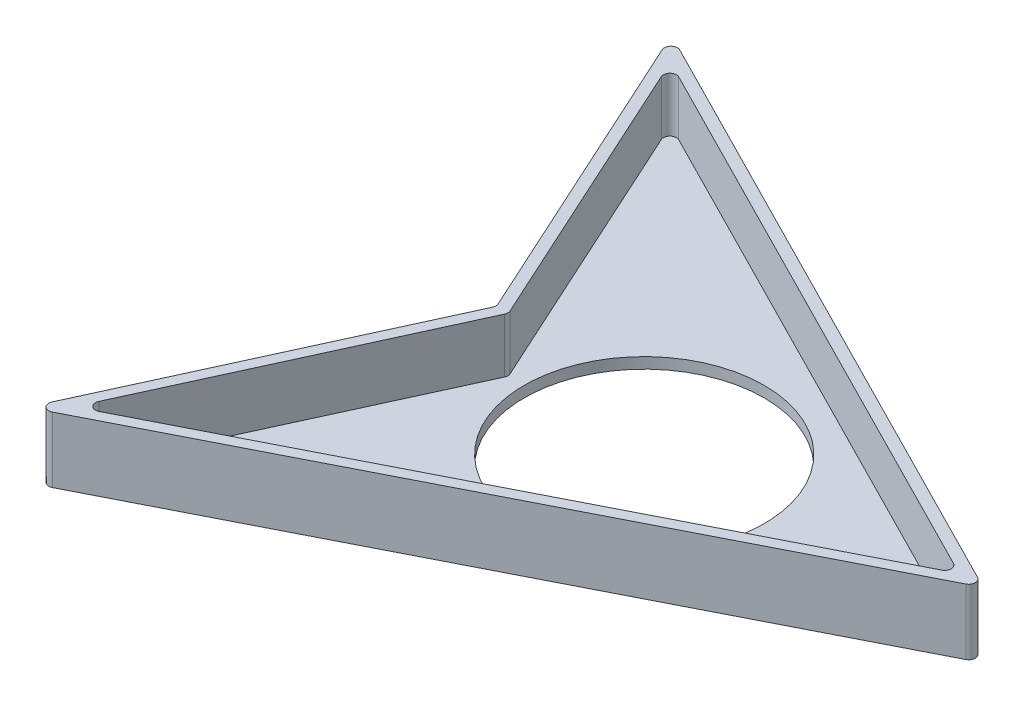
ISO-10303-21;
HEADER;
FILE_DESCRIPTION(('STEP AP214'),'2;1');
FILE_NAME('part.step','',(''),(''),'','','');
FILE_SCHEMA(('AUTOMOTIVE_DESIGN { 1 0 10303 214 1 1 1 1 }'));
ENDSEC;
DATA;
#1=APPLICATION_CONTEXT('core data for automotive mechanical design processes');
#2=APPLICATION_PROTOCOL_DEFINITION('international standard','automotive_design',2000,#1);
#3=PRODUCT_CONTEXT('',#1,'mechanical');
#4=PRODUCT('Part','Part','',(#3));
#5=PRODUCT_RELATED_PRODUCT_CATEGORY('part','',(#4));
#6=PRODUCT_DEFINITION_FORMATION('','',#4);
#7=PRODUCT_DEFINITION_CONTEXT('part definition',#1,'design');
#8=PRODUCT_DEFINITION('design','',#6,#7);
#9=PRODUCT_DEFINITION_SHAPE('','',#8);
#10=(LENGTH_UNIT() NAMED_UNIT(*) SI_UNIT(.MILLI.,.METRE.));
#11=(NAMED_UNIT(*) PLANE_ANGLE_UNIT() SI_UNIT($,.RADIAN.));
#12=(NAMED_UNIT(*) SI_UNIT($,.STERADIAN.) SOLID_ANGLE_UNIT());
#13=UNCERTAINTY_MEASURE_WITH_UNIT(LENGTH_MEASURE(1.E-05),#10,'distance_accuracy_value','');
#14=(GEOMETRIC_REPRESENTATION_CONTEXT(3) GLOBAL_UNCERTAINTY_ASSIGNED_CONTEXT((#13)) GLOBAL_UNIT_ASSIGNED_CONTEXT((#10,
#11,#12)) REPRESENTATION_CONTEXT('',''));
#15=CARTESIAN_POINT('',(0.,0.,0.));
#16=DIRECTION('',(0.,0.,1.));
#17=DIRECTION('',(1.,0.,0.));
#18=AXIS2_PLACEMENT_3D('',#15,#16,#17);
#19=CARTESIAN_POINT('',(0.,2.5,0.));
#20=DIRECTION('',(0.,-1.,0.));
#21=DIRECTION('',(0.,0.,-1.));
#22=AXIS2_PLACEMENT_3D('',#19,#20,#21);
#23=PLANE('',#22);
#24=DIRECTION('',(-0.415630656048194,0.,0.909533483579878));
#25=VECTOR('',#24,1.);
#26=CARTESIAN_POINT('',(-0.636673438505915,2.5,-0.290941459233736));
#27=LINE('',#26,#25);
#28=CARTESIAN_POINT('',(-0.826604700373397,2.5,0.124689196814458));
#29=VERTEX_POINT('',#28);
#30=CARTESIAN_POINT('',(-7.16274680552667,2.5,13.9902049317485));
#31=VERTEX_POINT('',#30);
#32=EDGE_CURVE('E181',#29,#31,#27,.T.);
#33=ORIENTED_EDGE('',*,*,#32,.T.);
#34=CARTESIAN_POINT('',(-6.88988676045271,2.5,14.114894128563));
#35=DIRECTION('',(0.,-1.,0.));
#36=DIRECTION('',(0.,0.,-1.));
#37=AXIS2_PLACEMENT_3D('',#34,#35,#36);
#38=CIRCLE('',#37,0.3);
#39=CARTESIAN_POINT('',(-6.7539651135463,2.5,14.3823362828735));
#40=VERTEX_POINT('',#39);
#41=EDGE_CURVE('E208',#31,#40,#38,.F.);
#42=ORIENTED_EDGE('',*,*,#41,.T.);
#43=DIRECTION('',(0.89147384770171,0.,-0.453072156354711));
#44=VECTOR('',#43,1.);
#45=CARTESIAN_POINT('',(4.42263808672645,2.5,8.7020712636321));
#46=LINE('',#45,#44);
#47=CARTESIAN_POINT('',(21.0187832273184,2.5,0.267442154310512));
#48=VERTEX_POINT('',#47);
#49=EDGE_CURVE('E176',#40,#48,#46,.T.);
#50=ORIENTED_EDGE('',*,*,#49,.T.);
#51=CARTESIAN_POINT('',(20.882861580412,2.5,0.));
#52=DIRECTION('',(0.,-1.,0.));
#53=DIRECTION('',(0.,0.,-1.));
#54=AXIS2_PLACEMENT_3D('',#51,#52,#53);
#55=CIRCLE('',#54,0.3);
#56=CARTESIAN_POINT('',(21.0187832273184,2.5,-0.267442154310512));
#57=VERTEX_POINT('',#56);
#58=EDGE_CURVE('E204',#48,#57,#55,.F.);
#59=ORIENTED_EDGE('',*,*,#58,.T.);
#60=DIRECTION('',(-0.89147384770171,0.,-0.453072156354711));
#61=VECTOR('',#60,1.);
#62=CARTESIAN_POINT('',(4.42263808672645,2.5,-8.7020712636321));
#63=LINE('',#62,#61);
#64=CARTESIAN_POINT('',(-6.7539651135463,2.5,-14.3823362828735));
#65=VERTEX_POINT('',#64);
#66=EDGE_CURVE('E279',#57,#65,#63,.T.);
#67=ORIENTED_EDGE('',*,*,#66,.T.);
#68=CARTESIAN_POINT('',(-6.88988676045271,2.5,-14.114894128563));
#69=DIRECTION('',(0.,-1.,0.));
#70=DIRECTION('',(0.,0.,-1.));
#71=AXIS2_PLACEMENT_3D('',#68,#69,#70);
#72=CIRCLE('',#71,0.3);
#73=CARTESIAN_POINT('',(-7.16274680552667,2.5,-13.9902049317485));
#74=VERTEX_POINT('',#73);
#75=EDGE_CURVE('E206',#65,#74,#72,.F.);
#76=ORIENTED_EDGE('',*,*,#75,.T.);
#77=DIRECTION('',(0.415630656048194,0.,0.909533483579878));
#78=VECTOR('',#77,1.);
#79=CARTESIAN_POINT('',(-0.636673438505915,2.5,0.290941459233736));
#80=LINE('',#79,#78);
#81=CARTESIAN_POINT('',(-0.826604700373397,2.5,-0.124689196814458));
#82=VERTEX_POINT('',#81);
#83=EDGE_CURVE('E282',#74,#82,#80,.T.);
#84=ORIENTED_EDGE('',*,*,#83,.T.);
#85=CARTESIAN_POINT('',(-1.09946474544736,2.5,0.));
#86=DIRECTION('',(0.,-1.,0.));
#87=DIRECTION('',(0.,0.,-1.));
#88=AXIS2_PLACEMENT_3D('',#85,#86,#87);
#89=CIRCLE('',#88,0.3);
#90=EDGE_CURVE('E11',#82,#29,#89,.T.);
#91=ORIENTED_EDGE('',*,*,#90,.T.);
#92=EDGE_LOOP('',(#33,#42,#50,#59,#67,#76,#84,#91));
#93=FACE_BOUND('',#92,.T.);
#94=DIRECTION('',(-0.415630656048194,0.,0.909533483579878));
#95=VECTOR('',#94,1.);
#96=CARTESIAN_POINT('',(-6.46994338022636,2.5,13.677119477257));
#97=LINE('',#96,#95);
#98=CARTESIAN_POINT('',(-0.276872327649716,2.5,0.124689196814458));
#99=VERTEX_POINT('',#98);
#100=CARTESIAN_POINT('',(-6.11288835496079,2.5,12.8957683034835));
#101=VERTEX_POINT('',#100);
#102=EDGE_CURVE('E365',#99,#101,#97,.T.);
#103=ORIENTED_EDGE('',*,*,#102,.F.);
#104=CARTESIAN_POINT('',(-0.549732372723681,2.5,0.));
#105=DIRECTION('',(0.,-1.,0.));
#106=DIRECTION('',(0.,0.,-1.));
#107=AXIS2_PLACEMENT_3D('',#104,#105,#106);
#108=CIRCLE('',#107,0.3);
#109=CARTESIAN_POINT('',(-0.276872327649717,2.5,-0.12468919681446));
#110=VERTEX_POINT('',#109);
#111=EDGE_CURVE('E175',#99,#110,#108,.F.);
#112=ORIENTED_EDGE('',*,*,#111,.T.);
#113=DIRECTION('',(0.415630656048194,0.,0.909533483579878));
#114=VECTOR('',#113,1.);
#115=CARTESIAN_POINT('',(-6.46994338022635,2.5,-13.677119477257));
#116=LINE('',#115,#114);
#117=CARTESIAN_POINT('',(-6.11288835496078,2.5,-12.8957683034835));
#118=VERTEX_POINT('',#117);
#119=EDGE_CURVE('E246',#118,#110,#116,.T.);
#120=ORIENTED_EDGE('',*,*,#119,.F.);
#121=CARTESIAN_POINT('',(-5.84002830988682,2.5,-13.0204575002979));
#122=DIRECTION('',(0.,-1.,0.));
#123=DIRECTION('',(0.,0.,-1.));
#124=AXIS2_PLACEMENT_3D('',#121,#122,#123);
#125=CIRCLE('',#124,0.3);
#126=CARTESIAN_POINT('',(-5.7041066629804,2.5,-13.2878996546085));
#127=VERTEX_POINT('',#126);
#128=EDGE_CURVE('E160',#118,#127,#125,.T.);
#129=ORIENTED_EDGE('',*,*,#128,.T.);
#130=DIRECTION('',(-0.89147384770171,0.,-0.453072156354711));
#131=VECTOR('',#130,1.);
#132=CARTESIAN_POINT('',(20.441430790206,2.5,0.));
#133=LINE('',#132,#131);
#134=CARTESIAN_POINT('',(19.9152062518034,2.5,-0.267442154310513));
#135=VERTEX_POINT('',#134);
#136=EDGE_CURVE('E243',#135,#127,#133,.T.);
#137=ORIENTED_EDGE('',*,*,#136,.F.);
#138=CARTESIAN_POINT('',(19.779284604897,2.5,0.));
#139=DIRECTION('',(0.,-1.,0.));
#140=DIRECTION('',(0.,0.,-1.));
#141=AXIS2_PLACEMENT_3D('',#138,#139,#140);
#142=CIRCLE('',#141,0.3);
#143=CARTESIAN_POINT('',(19.9152062518034,2.5,0.267442154310513));
#144=VERTEX_POINT('',#143);
#145=EDGE_CURVE('E161',#135,#144,#142,.T.);
#146=ORIENTED_EDGE('',*,*,#145,.T.);
#147=DIRECTION('',(0.89147384770171,0.,-0.453072156354711));
#148=VECTOR('',#147,1.);
#149=CARTESIAN_POINT('',(20.441430790206,2.5,0.));
#150=LINE('',#149,#148);
#151=CARTESIAN_POINT('',(-5.7041066629804,2.5,13.2878996546085));
#152=VERTEX_POINT('',#151);
#153=EDGE_CURVE('E271',#152,#144,#150,.T.);
#154=ORIENTED_EDGE('',*,*,#153,.F.);
#155=CARTESIAN_POINT('',(-5.84002830988682,2.5,13.0204575002979));
#156=DIRECTION('',(0.,-1.,0.));
#157=DIRECTION('',(0.,0.,-1.));
#158=AXIS2_PLACEMENT_3D('',#155,#156,#157);
#159=CIRCLE('',#158,0.3);
#160=EDGE_CURVE('E235',#152,#101,#159,.T.);
#161=ORIENTED_EDGE('',*,*,#160,.T.);
#162=EDGE_LOOP('',(#103,#112,#120,#129,#137,#146,#154,#161));
#163=FACE_BOUND('',#162,.T.);
#164=ADVANCED_FACE('F37',(#93,#163),#23,.F.);
#165=CARTESIAN_POINT('',(20.6679668683834,2.5,-0.445736923850855));
#166=DIRECTION('',(-0.453072156354711,0.,0.89147384770171));
#167=DIRECTION('',(0.89147384770171,0.,0.453072156354711));
#168=AXIS2_PLACEMENT_3D('',#165,#166,#167);
#169=PLANE('',#168);
#170=DIRECTION('',(-0.89147384770171,0.,-0.453072156354711));
#171=VECTOR('',#170,1.);
#172=CARTESIAN_POINT('',(4.42263808672645,-0.5,-8.7020712636321));
#173=LINE('',#172,#171);
#174=CARTESIAN_POINT('',(21.0187832273184,-0.5,-0.267442154310512));
#175=VERTEX_POINT('',#174);
#176=CARTESIAN_POINT('',(-6.7539651135463,-0.5,-14.3823362828735));
#177=VERTEX_POINT('',#176);
#178=EDGE_CURVE('E267',#175,#177,#173,.T.);
#179=ORIENTED_EDGE('',*,*,#178,.T.);
#180=DIRECTION('',(0.,-1.,0.));
#181=VECTOR('',#180,1.);
#182=CARTESIAN_POINT('',(-6.75396511354629,2.5,-14.3823362828735));
#183=LINE('',#182,#181);
#184=EDGE_CURVE('E233',#177,#65,#183,.F.);
#185=ORIENTED_EDGE('',*,*,#184,.T.);
#186=ORIENTED_EDGE('',*,*,#66,.F.);
#187=DIRECTION('',(0.,-1.,0.));
#188=VECTOR('',#187,1.);
#189=CARTESIAN_POINT('',(21.0187832273184,2.5,-0.267442154310513));
#190=LINE('',#189,#188);
#191=EDGE_CURVE('E230',#57,#175,#190,.T.);
#192=ORIENTED_EDGE('',*,*,#191,.T.);
#193=EDGE_LOOP('',(#179,#185,#186,#192));
#194=FACE_BOUND('',#193,.T.);
#195=ADVANCED_FACE('F307',(#194),#169,.F.);
#196=CARTESIAN_POINT('',(-6.92471012201629,2.5,-13.4693041492329));
#197=DIRECTION('',(0.909533483579878,0.,-0.415630656048194));
#198=DIRECTION('',(-0.415630656048194,0.,-0.909533483579878));
#199=AXIS2_PLACEMENT_3D('',#196,#197,#198);
#200=PLANE('',#199);
#201=ORIENTED_EDGE('',*,*,#83,.F.);
#202=DIRECTION('',(0.,-1.,0.));
#203=VECTOR('',#202,1.);
#204=CARTESIAN_POINT('',(-7.16274680552667,2.5,-13.9902049317485));
#205=LINE('',#204,#203);
#206=CARTESIAN_POINT('',(-7.16274680552667,-0.5,-13.9902049317485));
#207=VERTEX_POINT('',#206);
#208=EDGE_CURVE('E228',#74,#207,#205,.T.);
#209=ORIENTED_EDGE('',*,*,#208,.T.);
#210=DIRECTION('',(0.415630656048194,0.,0.909533483579878));
#211=VECTOR('',#210,1.);
#212=CARTESIAN_POINT('',(-0.636673438505915,-0.5,0.290941459233736));
#213=LINE('',#212,#211);
#214=CARTESIAN_POINT('',(-0.826604700373397,-0.5,-0.124689196814458));
#215=VERTEX_POINT('',#214);
#216=EDGE_CURVE('E270',#207,#215,#213,.T.);
#217=ORIENTED_EDGE('',*,*,#216,.T.);
#218=DIRECTION('',(0.,-1.,0.));
#219=VECTOR('',#218,1.);
#220=CARTESIAN_POINT('',(-0.826604700373397,2.5,-0.124689196814458));
#221=LINE('',#220,#219);
#222=EDGE_CURVE('E226',#215,#82,#221,.F.);
#223=ORIENTED_EDGE('',*,*,#222,.T.);
#224=EDGE_LOOP('',(#201,#209,#217,#223));
#225=FACE_BOUND('',#224,.T.);
#226=ADVANCED_FACE('F312',(#225),#200,.F.);
#227=CARTESIAN_POINT('',(-6.92471012201629,2.5,13.4693041492329));
#228=DIRECTION('',(0.909533483579878,0.,0.415630656048194));
#229=DIRECTION('',(0.415630656048194,0.,-0.909533483579878));
#230=AXIS2_PLACEMENT_3D('',#227,#228,#229);
#231=PLANE('',#230);
#232=DIRECTION('',(-0.415630656048194,0.,0.909533483579878));
#233=VECTOR('',#232,1.);
#234=CARTESIAN_POINT('',(-0.636673438505915,-0.5,-0.290941459233736));
#235=LINE('',#234,#233);
#236=CARTESIAN_POINT('',(-0.826604700373397,-0.5,0.124689196814458));
#237=VERTEX_POINT('',#236);
#238=CARTESIAN_POINT('',(-7.16274680552667,-0.5,13.9902049317485));
#239=VERTEX_POINT('',#238);
#240=EDGE_CURVE('E273',#237,#239,#235,.T.);
#241=ORIENTED_EDGE('',*,*,#240,.T.);
#242=DIRECTION('',(0.,-1.,0.));
#243=VECTOR('',#242,1.);
#244=CARTESIAN_POINT('',(-7.16274680552667,2.5,13.9902049317485));
#245=LINE('',#244,#243);
#246=EDGE_CURVE('E224',#239,#31,#245,.F.);
#247=ORIENTED_EDGE('',*,*,#246,.T.);
#248=ORIENTED_EDGE('',*,*,#32,.F.);
#249=DIRECTION('',(0.,-1.,0.));
#250=VECTOR('',#249,1.);
#251=CARTESIAN_POINT('',(-0.826604700373397,-0.5,0.124689196814459));
#252=LINE('',#251,#250);
#253=EDGE_CURVE('E221',#29,#237,#252,.T.);
#254=ORIENTED_EDGE('',*,*,#253,.T.);
#255=EDGE_LOOP('',(#241,#247,#248,#254));
#256=FACE_BOUND('',#255,.T.);
#257=ADVANCED_FACE('F316',(#256),#231,.F.);
#258=CARTESIAN_POINT('',(20.6679668683834,2.5,0.445736923850855));
#259=DIRECTION('',(-0.453072156354711,0.,-0.89147384770171));
#260=DIRECTION('',(-0.89147384770171,0.,0.453072156354711));
#261=AXIS2_PLACEMENT_3D('',#258,#259,#260);
#262=PLANE('',#261);
#263=ORIENTED_EDGE('',*,*,#49,.F.);
#264=DIRECTION('',(0.,-1.,0.));
#265=VECTOR('',#264,1.);
#266=CARTESIAN_POINT('',(-6.75396511354629,2.5,14.3823362828735));
#267=LINE('',#266,#265);
#268=CARTESIAN_POINT('',(-6.7539651135463,-0.5,14.3823362828735));
#269=VERTEX_POINT('',#268);
#270=EDGE_CURVE('E213',#40,#269,#267,.T.);
#271=ORIENTED_EDGE('',*,*,#270,.T.);
#272=DIRECTION('',(0.89147384770171,0.,-0.453072156354711));
#273=VECTOR('',#272,1.);
#274=CARTESIAN_POINT('',(4.42263808672645,-0.5,8.7020712636321));
#275=LINE('',#274,#273);
#276=CARTESIAN_POINT('',(21.0187832273184,-0.5,0.267442154310512));
#277=VERTEX_POINT('',#276);
#278=EDGE_CURVE('E276',#269,#277,#275,.T.);
#279=ORIENTED_EDGE('',*,*,#278,.T.);
#280=DIRECTION('',(0.,-1.,0.));
#281=VECTOR('',#280,1.);
#282=CARTESIAN_POINT('',(21.0187832273184,2.5,0.267442154310513));
#283=LINE('',#282,#281);
#284=EDGE_CURVE('E211',#277,#48,#283,.F.);
#285=ORIENTED_EDGE('',*,*,#284,.T.);
#286=EDGE_LOOP('',(#263,#271,#279,#285));
#287=FACE_BOUND('',#286,.T.);
#288=ADVANCED_FACE('F298',(#287),#262,.F.);
#289=CARTESIAN_POINT('',(0.,-0.5,0.));
#290=DIRECTION('',(0.,-1.,0.));
#291=DIRECTION('',(0.,0.,-1.));
#292=AXIS2_PLACEMENT_3D('',#289,#290,#291);
#293=PLANE('',#292);
#294=CARTESIAN_POINT('',(6.,-0.5,0.));
#295=DIRECTION('',(0.,1.,0.));
#296=DIRECTION('',(0.,0.,1.));
#297=AXIS2_PLACEMENT_3D('',#294,#295,#296);
#298=CIRCLE('',#297,5.5);
#299=CARTESIAN_POINT('',(6.,-0.5,5.5));
#300=VERTEX_POINT('',#299);
#301=EDGE_CURVE('E261',#300,#300,#298,.T.);
#302=ORIENTED_EDGE('',*,*,#301,.T.);
#303=EDGE_LOOP('',(#302));
#304=FACE_BOUND('',#303,.T.);
#305=ORIENTED_EDGE('',*,*,#278,.F.);
#306=CARTESIAN_POINT('',(-6.88988676045271,-0.5,14.114894128563));
#307=DIRECTION('',(0.,-1.,0.));
#308=DIRECTION('',(0.,0.,-1.));
#309=AXIS2_PLACEMENT_3D('',#306,#307,#308);
#310=CIRCLE('',#309,0.3);
#311=EDGE_CURVE('E219',#269,#239,#310,.T.);
#312=ORIENTED_EDGE('',*,*,#311,.T.);
#313=ORIENTED_EDGE('',*,*,#240,.F.);
#314=CARTESIAN_POINT('',(-1.09946474544736,-0.5,0.));
#315=DIRECTION('',(0.,-1.,0.));
#316=DIRECTION('',(0.,0.,-1.));
#317=AXIS2_PLACEMENT_3D('',#314,#315,#316);
#318=CIRCLE('',#317,0.3);
#319=EDGE_CURVE('E45',#237,#215,#318,.F.);
#320=ORIENTED_EDGE('',*,*,#319,.T.);
#321=ORIENTED_EDGE('',*,*,#216,.F.);
#322=CARTESIAN_POINT('',(-6.88988676045271,-0.5,-14.114894128563));
#323=DIRECTION('',(0.,-1.,0.));
#324=DIRECTION('',(0.,0.,-1.));
#325=AXIS2_PLACEMENT_3D('',#322,#323,#324);
#326=CIRCLE('',#325,0.3);
#327=EDGE_CURVE('E59',#207,#177,#326,.T.);
#328=ORIENTED_EDGE('',*,*,#327,.T.);
#329=ORIENTED_EDGE('',*,*,#178,.F.);
#330=CARTESIAN_POINT('',(20.882861580412,-0.5,0.));
#331=DIRECTION('',(0.,-1.,0.));
#332=DIRECTION('',(0.,0.,-1.));
#333=AXIS2_PLACEMENT_3D('',#330,#331,#332);
#334=CIRCLE('',#333,0.3);
#335=EDGE_CURVE('E216',#175,#277,#334,.T.);
#336=ORIENTED_EDGE('',*,*,#335,.T.);
#337=EDGE_LOOP('',(#305,#312,#313,#320,#321,#328,#329,#336));
#338=FACE_BOUND('',#337,.T.);
#339=ADVANCED_FACE('F300',(#304,#338),#293,.T.);
#340=CARTESIAN_POINT('',(20.441430790206,2.5,0.));
#341=DIRECTION('',(-0.453072156354711,0.,0.89147384770171));
#342=DIRECTION('',(0.89147384770171,0.,0.453072156354711));
#343=AXIS2_PLACEMENT_3D('',#340,#341,#342);
#344=PLANE('',#343);
#345=DIRECTION('',(-0.89147384770171,0.,-0.453072156354711));
#346=VECTOR('',#345,1.);
#347=CARTESIAN_POINT('',(20.441430790206,0.,0.));
#348=LINE('',#347,#346);
#349=CARTESIAN_POINT('',(19.9152062518034,0.,-0.267442154310513));
#350=VERTEX_POINT('',#349);
#351=CARTESIAN_POINT('',(-5.7041066629804,0.,-13.2878996546085));
#352=VERTEX_POINT('',#351);
#353=EDGE_CURVE('E257',#350,#352,#348,.T.);
#354=ORIENTED_EDGE('',*,*,#353,.F.);
#355=DIRECTION('',(0.,-1.,0.));
#356=VECTOR('',#355,1.);
#357=CARTESIAN_POINT('',(19.9152062518034,2.5,-0.267442154310514));
#358=LINE('',#357,#356);
#359=EDGE_CURVE('E198',#350,#135,#358,.F.);
#360=ORIENTED_EDGE('',*,*,#359,.T.);
#361=ORIENTED_EDGE('',*,*,#136,.T.);
#362=DIRECTION('',(0.,-1.,0.));
#363=VECTOR('',#362,1.);
#364=CARTESIAN_POINT('',(-5.7041066629804,0.,-13.2878996546085));
#365=LINE('',#364,#363);
#366=EDGE_CURVE('E195',#127,#352,#365,.T.);
#367=ORIENTED_EDGE('',*,*,#366,.T.);
#368=EDGE_LOOP('',(#354,#360,#361,#367));
#369=FACE_BOUND('',#368,.T.);
#370=ADVANCED_FACE('F252',(#369),#344,.T.);
#371=CARTESIAN_POINT('',(-6.46994338022635,2.5,-13.677119477257));
#372=DIRECTION('',(0.909533483579878,0.,-0.415630656048194));
#373=DIRECTION('',(-0.415630656048194,0.,-0.909533483579878));
#374=AXIS2_PLACEMENT_3D('',#371,#372,#373);
#375=PLANE('',#374);
#376=ORIENTED_EDGE('',*,*,#119,.T.);
#377=DIRECTION('',(0.,-1.,0.));
#378=VECTOR('',#377,1.);
#379=CARTESIAN_POINT('',(-0.276872327649717,2.5,-0.124689196814458));
#380=LINE('',#379,#378);
#381=CARTESIAN_POINT('',(-0.276872327649717,0.,-0.12468919681446));
#382=VERTEX_POINT('',#381);
#383=EDGE_CURVE('E202',#110,#382,#380,.T.);
#384=ORIENTED_EDGE('',*,*,#383,.T.);
#385=DIRECTION('',(0.415630656048194,0.,0.909533483579878));
#386=VECTOR('',#385,1.);
#387=CARTESIAN_POINT('',(-6.46994338022635,0.,-13.677119477257));
#388=LINE('',#387,#386);
#389=CARTESIAN_POINT('',(-6.11288835496078,0.,-12.8957683034835));
#390=VERTEX_POINT('',#389);
#391=EDGE_CURVE('E155',#390,#382,#388,.T.);
#392=ORIENTED_EDGE('',*,*,#391,.F.);
#393=DIRECTION('',(0.,-1.,0.));
#394=VECTOR('',#393,1.);
#395=CARTESIAN_POINT('',(-6.11288835496078,2.5,-12.8957683034835));
#396=LINE('',#395,#394);
#397=EDGE_CURVE('E200',#390,#118,#396,.F.);
#398=ORIENTED_EDGE('',*,*,#397,.T.);
#399=EDGE_LOOP('',(#376,#384,#392,#398));
#400=FACE_BOUND('',#399,.T.);
#401=ADVANCED_FACE('F259',(#400),#375,.T.);
#402=CARTESIAN_POINT('',(-6.46994338022636,2.5,13.677119477257));
#403=DIRECTION('',(0.909533483579878,0.,0.415630656048194));
#404=DIRECTION('',(0.415630656048194,0.,-0.909533483579878));
#405=AXIS2_PLACEMENT_3D('',#402,#403,#404);
#406=PLANE('',#405);
#407=ORIENTED_EDGE('',*,*,#102,.T.);
#408=DIRECTION('',(0.,-1.,0.));
#409=VECTOR('',#408,1.);
#410=CARTESIAN_POINT('',(-6.11288835496079,0.,12.8957683034835));
#411=LINE('',#410,#409);
#412=CARTESIAN_POINT('',(-6.11288835496079,0.,12.8957683034835));
#413=VERTEX_POINT('',#412);
#414=EDGE_CURVE('E170',#101,#413,#411,.T.);
#415=ORIENTED_EDGE('',*,*,#414,.T.);
#416=DIRECTION('',(-0.415630656048194,0.,0.909533483579878));
#417=VECTOR('',#416,1.);
#418=CARTESIAN_POINT('',(-6.46994338022636,0.,13.677119477257));
#419=LINE('',#418,#417);
#420=CARTESIAN_POINT('',(-0.276872327649716,0.,0.124689196814458));
#421=VERTEX_POINT('',#420);
#422=EDGE_CURVE('E153',#421,#413,#419,.T.);
#423=ORIENTED_EDGE('',*,*,#422,.F.);
#424=DIRECTION('',(0.,-1.,0.));
#425=VECTOR('',#424,1.);
#426=CARTESIAN_POINT('',(-0.276872327649716,2.5,0.124689196814458));
#427=LINE('',#426,#425);
#428=EDGE_CURVE('E167',#421,#99,#427,.F.);
#429=ORIENTED_EDGE('',*,*,#428,.T.);
#430=EDGE_LOOP('',(#407,#415,#423,#429));
#431=FACE_BOUND('',#430,.T.);
#432=ADVANCED_FACE('F166',(#431),#406,.T.);
#433=CARTESIAN_POINT('',(20.441430790206,2.5,0.));
#434=DIRECTION('',(-0.453072156354711,0.,-0.89147384770171));
#435=DIRECTION('',(-0.89147384770171,0.,0.453072156354711));
#436=AXIS2_PLACEMENT_3D('',#433,#434,#435);
#437=PLANE('',#436);
#438=DIRECTION('',(0.89147384770171,0.,-0.453072156354711));
#439=VECTOR('',#438,1.);
#440=CARTESIAN_POINT('',(20.441430790206,0.,0.));
#441=LINE('',#440,#439);
#442=CARTESIAN_POINT('',(-5.7041066629804,0.,13.2878996546085));
#443=VERTEX_POINT('',#442);
#444=CARTESIAN_POINT('',(19.9152062518034,0.,0.267442154310513));
#445=VERTEX_POINT('',#444);
#446=EDGE_CURVE('E171',#443,#445,#441,.T.);
#447=ORIENTED_EDGE('',*,*,#446,.F.);
#448=DIRECTION('',(0.,-1.,0.));
#449=VECTOR('',#448,1.);
#450=CARTESIAN_POINT('',(-5.70410666298041,2.5,13.2878996546085));
#451=LINE('',#450,#449);
#452=EDGE_CURVE('E193',#443,#152,#451,.F.);
#453=ORIENTED_EDGE('',*,*,#452,.T.);
#454=ORIENTED_EDGE('',*,*,#153,.T.);
#455=DIRECTION('',(0.,-1.,0.));
#456=VECTOR('',#455,1.);
#457=CARTESIAN_POINT('',(19.9152062518034,0.,0.267442154310513));
#458=LINE('',#457,#456);
#459=EDGE_CURVE('E190',#144,#445,#458,.T.);
#460=ORIENTED_EDGE('',*,*,#459,.T.);
#461=EDGE_LOOP('',(#447,#453,#454,#460));
#462=FACE_BOUND('',#461,.T.);
#463=ADVANCED_FACE('F338',(#462),#437,.T.);
#464=CARTESIAN_POINT('',(0.,0.,0.));
#465=DIRECTION('',(0.,-1.,0.));
#466=DIRECTION('',(0.,0.,-1.));
#467=AXIS2_PLACEMENT_3D('',#464,#465,#466);
#468=PLANE('',#467);
#469=CARTESIAN_POINT('',(6.,0.,0.));
#470=DIRECTION('',(0.,1.,0.));
#471=DIRECTION('',(0.,0.,1.));
#472=AXIS2_PLACEMENT_3D('',#469,#470,#471);
#473=CIRCLE('',#472,5.5);
#474=CARTESIAN_POINT('',(6.,0.,5.5));
#475=VERTEX_POINT('',#474);
#476=EDGE_CURVE('E360',#475,#475,#473,.T.);
#477=ORIENTED_EDGE('',*,*,#476,.F.);
#478=EDGE_LOOP('',(#477));
#479=FACE_BOUND('',#478,.T.);
#480=ORIENTED_EDGE('',*,*,#422,.T.);
#481=CARTESIAN_POINT('',(-5.84002830988682,0.,13.0204575002979));
#482=DIRECTION('',(0.,-1.,0.));
#483=DIRECTION('',(0.,0.,-1.));
#484=AXIS2_PLACEMENT_3D('',#481,#482,#483);
#485=CIRCLE('',#484,0.3);
#486=EDGE_CURVE('E188',#413,#443,#485,.F.);
#487=ORIENTED_EDGE('',*,*,#486,.T.);
#488=ORIENTED_EDGE('',*,*,#446,.T.);
#489=CARTESIAN_POINT('',(19.779284604897,0.,0.));
#490=DIRECTION('',(0.,-1.,0.));
#491=DIRECTION('',(0.,0.,-1.));
#492=AXIS2_PLACEMENT_3D('',#489,#490,#491);
#493=CIRCLE('',#492,0.3);
#494=EDGE_CURVE('E186',#445,#350,#493,.F.);
#495=ORIENTED_EDGE('',*,*,#494,.T.);
#496=ORIENTED_EDGE('',*,*,#353,.T.);
#497=CARTESIAN_POINT('',(-5.84002830988682,0.,-13.0204575002979));
#498=DIRECTION('',(0.,-1.,0.));
#499=DIRECTION('',(0.,0.,-1.));
#500=AXIS2_PLACEMENT_3D('',#497,#498,#499);
#501=CIRCLE('',#500,0.3);
#502=EDGE_CURVE('E178',#352,#390,#501,.F.);
#503=ORIENTED_EDGE('',*,*,#502,.T.);
#504=ORIENTED_EDGE('',*,*,#391,.T.);
#505=CARTESIAN_POINT('',(-0.549732372723681,0.,0.));
#506=DIRECTION('',(0.,-1.,0.));
#507=DIRECTION('',(0.,0.,-1.));
#508=AXIS2_PLACEMENT_3D('',#505,#506,#507);
#509=CIRCLE('',#508,0.3);
#510=EDGE_CURVE('E150',#382,#421,#509,.T.);
#511=ORIENTED_EDGE('',*,*,#510,.T.);
#512=EDGE_LOOP('',(#480,#487,#488,#495,#496,#503,#504,#511));
#513=FACE_BOUND('',#512,.T.);
#514=ADVANCED_FACE('F152',(#479,#513),#468,.F.);
#515=CARTESIAN_POINT('',(6.,-0.5,0.));
#516=DIRECTION('',(0.,1.,0.));
#517=DIRECTION('',(0.,0.,1.));
#518=AXIS2_PLACEMENT_3D('',#515,#516,#517);
#519=CYLINDRICAL_SURFACE('',#518,5.5);
#520=ORIENTED_EDGE('',*,*,#301,.F.);
#521=EDGE_LOOP('',(#520));
#522=FACE_BOUND('',#521,.T.);
#523=ORIENTED_EDGE('',*,*,#476,.T.);
#524=EDGE_LOOP('',(#523));
#525=FACE_BOUND('',#524,.T.);
#526=ADVANCED_FACE('F344',(#522,#525),#519,.F.);
#527=CARTESIAN_POINT('',(-5.84002830988682,2.5,13.0204575002979));
#528=DIRECTION('',(0.,1.,0.));
#529=DIRECTION('',(0.,0.,1.));
#530=AXIS2_PLACEMENT_3D('',#527,#528,#529);
#531=CYLINDRICAL_SURFACE('',#530,0.3);
#532=ORIENTED_EDGE('',*,*,#160,.F.);
#533=ORIENTED_EDGE('',*,*,#452,.F.);
#534=ORIENTED_EDGE('',*,*,#486,.F.);
#535=ORIENTED_EDGE('',*,*,#414,.F.);
#536=EDGE_LOOP('',(#532,#533,#534,#535));
#537=FACE_BOUND('',#536,.T.);
#538=ADVANCED_FACE('F347',(#537),#531,.F.);
#539=CARTESIAN_POINT('',(19.779284604897,2.5,0.));
#540=DIRECTION('',(0.,1.,0.));
#541=DIRECTION('',(0.,0.,1.));
#542=AXIS2_PLACEMENT_3D('',#539,#540,#541);
#543=CYLINDRICAL_SURFACE('',#542,0.3);
#544=ORIENTED_EDGE('',*,*,#145,.F.);
#545=ORIENTED_EDGE('',*,*,#359,.F.);
#546=ORIENTED_EDGE('',*,*,#494,.F.);
#547=ORIENTED_EDGE('',*,*,#459,.F.);
#548=EDGE_LOOP('',(#544,#545,#546,#547));
#549=FACE_BOUND('',#548,.T.);
#550=ADVANCED_FACE('F352',(#549),#543,.F.);
#551=CARTESIAN_POINT('',(-0.549732372723681,2.5,0.));
#552=DIRECTION('',(0.,-1.,0.));
#553=DIRECTION('',(0.,0.,-1.));
#554=AXIS2_PLACEMENT_3D('',#551,#552,#553);
#555=CYLINDRICAL_SURFACE('',#554,0.3);
#556=ORIENTED_EDGE('',*,*,#111,.F.);
#557=ORIENTED_EDGE('',*,*,#428,.F.);
#558=ORIENTED_EDGE('',*,*,#510,.F.);
#559=ORIENTED_EDGE('',*,*,#383,.F.);
#560=EDGE_LOOP('',(#556,#557,#558,#559));
#561=FACE_BOUND('',#560,.T.);
#562=ADVANCED_FACE('F174',(#561),#555,.T.);
#563=CARTESIAN_POINT('',(-5.84002830988682,2.5,-13.0204575002979));
#564=DIRECTION('',(0.,1.,0.));
#565=DIRECTION('',(0.,0.,1.));
#566=AXIS2_PLACEMENT_3D('',#563,#564,#565);
#567=CYLINDRICAL_SURFACE('',#566,0.3);
#568=ORIENTED_EDGE('',*,*,#128,.F.);
#569=ORIENTED_EDGE('',*,*,#397,.F.);
#570=ORIENTED_EDGE('',*,*,#502,.F.);
#571=ORIENTED_EDGE('',*,*,#366,.F.);
#572=EDGE_LOOP('',(#568,#569,#570,#571));
#573=FACE_BOUND('',#572,.T.);
#574=ADVANCED_FACE('F256',(#573),#567,.F.);
#575=CARTESIAN_POINT('',(-6.88988676045271,2.5,14.114894128563));
#576=DIRECTION('',(0.,-1.,0.));
#577=DIRECTION('',(0.,0.,-1.));
#578=AXIS2_PLACEMENT_3D('',#575,#576,#577);
#579=CYLINDRICAL_SURFACE('',#578,0.3);
#580=ORIENTED_EDGE('',*,*,#41,.F.);
#581=ORIENTED_EDGE('',*,*,#246,.F.);
#582=ORIENTED_EDGE('',*,*,#311,.F.);
#583=ORIENTED_EDGE('',*,*,#270,.F.);
#584=EDGE_LOOP('',(#580,#581,#582,#583));
#585=FACE_BOUND('',#584,.T.);
#586=ADVANCED_FACE('F295',(#585),#579,.T.);
#587=CARTESIAN_POINT('',(-6.88988676045271,2.5,-14.114894128563));
#588=DIRECTION('',(0.,-1.,0.));
#589=DIRECTION('',(0.,0.,-1.));
#590=AXIS2_PLACEMENT_3D('',#587,#588,#589);
#591=CYLINDRICAL_SURFACE('',#590,0.3);
#592=ORIENTED_EDGE('',*,*,#75,.F.);
#593=ORIENTED_EDGE('',*,*,#184,.F.);
#594=ORIENTED_EDGE('',*,*,#327,.F.);
#595=ORIENTED_EDGE('',*,*,#208,.F.);
#596=EDGE_LOOP('',(#592,#593,#594,#595));
#597=FACE_BOUND('',#596,.T.);
#598=ADVANCED_FACE('F310',(#597),#591,.T.);
#599=CARTESIAN_POINT('',(-1.09946474544736,2.5,0.));
#600=DIRECTION('',(0.,1.,0.));
#601=DIRECTION('',(0.,0.,1.));
#602=AXIS2_PLACEMENT_3D('',#599,#600,#601);
#603=CYLINDRICAL_SURFACE('',#602,0.3);
#604=ORIENTED_EDGE('',*,*,#90,.F.);
#605=ORIENTED_EDGE('',*,*,#222,.F.);
#606=ORIENTED_EDGE('',*,*,#319,.F.);
#607=ORIENTED_EDGE('',*,*,#253,.F.);
#608=EDGE_LOOP('',(#604,#605,#606,#607));
#609=FACE_BOUND('',#608,.T.);
#610=ADVANCED_FACE('F315',(#609),#603,.F.);
#611=CARTESIAN_POINT('',(20.882861580412,2.5,0.));
#612=DIRECTION('',(0.,-1.,0.));
#613=DIRECTION('',(0.,0.,-1.));
#614=AXIS2_PLACEMENT_3D('',#611,#612,#613);
#615=CYLINDRICAL_SURFACE('',#614,0.3);
#616=ORIENTED_EDGE('',*,*,#58,.F.);
#617=ORIENTED_EDGE('',*,*,#284,.F.);
#618=ORIENTED_EDGE('',*,*,#335,.F.);
#619=ORIENTED_EDGE('',*,*,#191,.F.);
#620=EDGE_LOOP('',(#616,#617,#618,#619));
#621=FACE_BOUND('',#620,.T.);
#622=ADVANCED_FACE('F39',(#621),#615,.T.);
#623=CLOSED_SHELL('',(#164,#195,#226,#257,#288,#339,#370,#401,#432,#463,#514,#526,#538,#550,
#562,#574,#586,#598,#610,#622));
#624=MANIFOLD_SOLID_BREP('B2',#623);
#625=ADVANCED_BREP_SHAPE_REPRESENTATION('',(#18,#624),#14);
#626=SHAPE_DEFINITION_REPRESENTATION(#9,#625);
ENDSEC;
END-ISO-10303-21;
